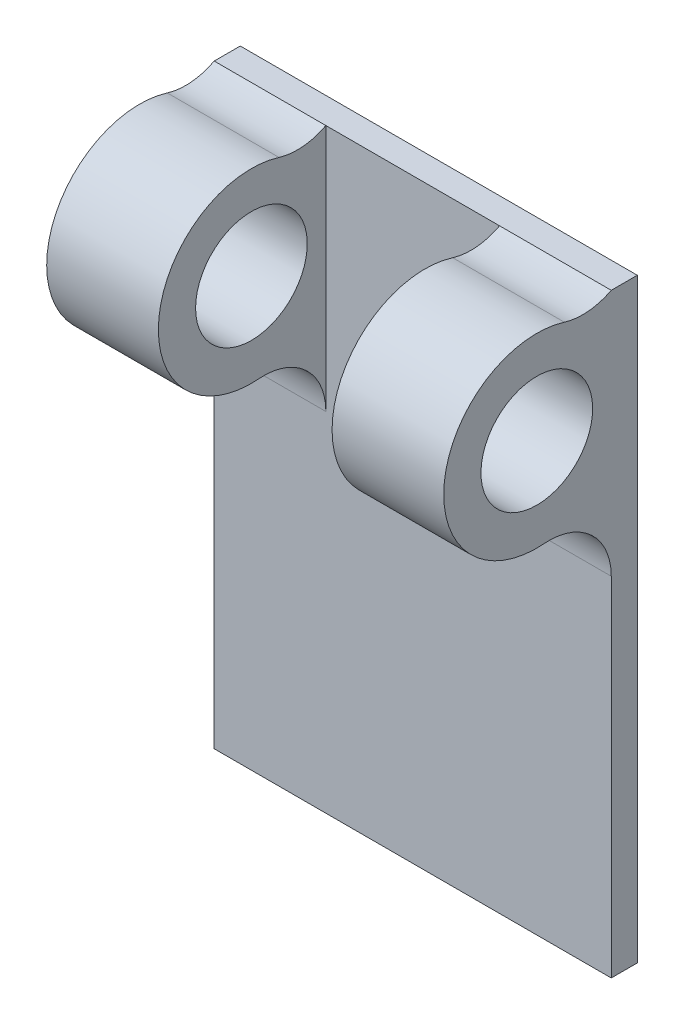
ISO-10303-21;
HEADER;
FILE_DESCRIPTION(('STEP AP214'),'2;1');
FILE_NAME('part.step','',(''),(''),'','','');
FILE_SCHEMA(('AUTOMOTIVE_DESIGN { 1 0 10303 214 1 1 1 1 }'));
ENDSEC;
DATA;
#1=APPLICATION_CONTEXT('core data for automotive mechanical design processes');
#2=APPLICATION_PROTOCOL_DEFINITION('international standard','automotive_design',2000,#1);
#3=PRODUCT_CONTEXT('',#1,'mechanical');
#4=PRODUCT('Part','Part','',(#3));
#5=PRODUCT_RELATED_PRODUCT_CATEGORY('part','',(#4));
#6=PRODUCT_DEFINITION_FORMATION('','',#4);
#7=PRODUCT_DEFINITION_CONTEXT('part definition',#1,'design');
#8=PRODUCT_DEFINITION('design','',#6,#7);
#9=PRODUCT_DEFINITION_SHAPE('','',#8);
#10=(LENGTH_UNIT() NAMED_UNIT(*) SI_UNIT(.MILLI.,.METRE.));
#11=(NAMED_UNIT(*) PLANE_ANGLE_UNIT() SI_UNIT($,.RADIAN.));
#12=(NAMED_UNIT(*) SI_UNIT($,.STERADIAN.) SOLID_ANGLE_UNIT());
#13=UNCERTAINTY_MEASURE_WITH_UNIT(LENGTH_MEASURE(1.E-05),#10,'distance_accuracy_value','');
#14=(GEOMETRIC_REPRESENTATION_CONTEXT(3) GLOBAL_UNCERTAINTY_ASSIGNED_CONTEXT((#13)) GLOBAL_UNIT_ASSIGNED_CONTEXT((#10,
#11,#12)) REPRESENTATION_CONTEXT('',''));
#15=CARTESIAN_POINT('',(0.,0.,0.));
#16=DIRECTION('',(0.,0.,1.));
#17=DIRECTION('',(1.,0.,0.));
#18=AXIS2_PLACEMENT_3D('',#15,#16,#17);
#19=CARTESIAN_POINT('',(640.,-150.,162.));
#20=DIRECTION('',(-1.,0.,0.));
#21=DIRECTION('',(0.,-1.,0.));
#22=AXIS2_PLACEMENT_3D('',#19,#20,#21);
#23=CYLINDRICAL_SURFACE('',#22,90.);
#24=CARTESIAN_POINT('',(180.,-150.,162.));
#25=DIRECTION('',(-1.,0.,0.));
#26=DIRECTION('',(0.,0.,1.));
#27=AXIS2_PLACEMENT_3D('',#24,#25,#26);
#28=CIRCLE('',#27,90.);
#29=CARTESIAN_POINT('',(180.,-150.,252.));
#30=VERTEX_POINT('',#29);
#31=EDGE_CURVE('E152',#30,#30,#28,.F.);
#32=ORIENTED_EDGE('',*,*,#31,.T.);
#33=EDGE_LOOP('',(#32));
#34=FACE_BOUND('',#33,.T.);
#35=CARTESIAN_POINT('',(0.,-150.,162.));
#36=DIRECTION('',(-1.,0.,0.));
#37=DIRECTION('',(0.,-1.,0.));
#38=AXIS2_PLACEMENT_3D('',#35,#36,#37);
#39=CIRCLE('',#38,90.);
#40=CARTESIAN_POINT('',(0.,-240.,162.));
#41=VERTEX_POINT('',#40);
#42=EDGE_CURVE('E231',#41,#41,#39,.T.);
#43=ORIENTED_EDGE('',*,*,#42,.T.);
#44=EDGE_LOOP('',(#43));
#45=FACE_BOUND('',#44,.T.);
#46=ADVANCED_FACE('F43',(#34,#45),#23,.F.);
#47=CARTESIAN_POINT('',(640.,-150.,162.));
#48=DIRECTION('',(-1.,0.,0.));
#49=DIRECTION('',(0.,-1.,0.));
#50=AXIS2_PLACEMENT_3D('',#47,#48,#49);
#51=CYLINDRICAL_SURFACE('',#50,150.);
#52=CARTESIAN_POINT('',(180.,-150.,162.));
#53=DIRECTION('',(-1.,0.,0.));
#54=DIRECTION('',(0.,0.,1.));
#55=AXIS2_PLACEMENT_3D('',#52,#53,#54);
#56=CIRCLE('',#55,150.);
#57=CARTESIAN_POINT('',(180.,-6.72295296391534,117.596308795106));
#58=VERTEX_POINT('',#57);
#59=CARTESIAN_POINT('',(180.,-299.519229532525,150.));
#60=VERTEX_POINT('',#59);
#61=EDGE_CURVE('E153',#58,#60,#56,.F.);
#62=ORIENTED_EDGE('',*,*,#61,.F.);
#63=DIRECTION('',(-1.,0.,0.));
#64=VECTOR('',#63,1.);
#65=CARTESIAN_POINT('',(640.,-6.72295296391528,117.596308795106));
#66=LINE('',#65,#64);
#67=CARTESIAN_POINT('',(0.,-6.72295296391537,117.596308795106));
#68=VERTEX_POINT('',#67);
#69=EDGE_CURVE('E151',#58,#68,#66,.T.);
#70=ORIENTED_EDGE('',*,*,#69,.T.);
#71=CARTESIAN_POINT('',(0.,-150.,162.));
#72=DIRECTION('',(-1.,0.,0.));
#73=DIRECTION('',(0.,-1.,0.));
#74=AXIS2_PLACEMENT_3D('',#71,#72,#73);
#75=CIRCLE('',#74,150.);
#76=CARTESIAN_POINT('',(0.,-299.519229532525,150.));
#77=VERTEX_POINT('',#76);
#78=EDGE_CURVE('E226',#77,#68,#75,.T.);
#79=ORIENTED_EDGE('',*,*,#78,.F.);
#80=DIRECTION('',(-1.,0.,0.));
#81=VECTOR('',#80,1.);
#82=CARTESIAN_POINT('',(640.,-299.519229532525,150.));
#83=LINE('',#82,#81);
#84=EDGE_CURVE('E188',#77,#60,#83,.F.);
#85=ORIENTED_EDGE('',*,*,#84,.T.);
#86=EDGE_LOOP('',(#62,#70,#79,#85));
#87=FACE_BOUND('',#86,.T.);
#88=ADVANCED_FACE('F250',(#87),#51,.T.);
#89=CARTESIAN_POINT('',(0.,88.7950783934744,87.9938479918426));
#90=DIRECTION('',(1.,0.,0.));
#91=DIRECTION('',(0.,1.,0.));
#92=AXIS2_PLACEMENT_3D('',#89,#90,#91);
#93=CYLINDRICAL_SURFACE('',#92,100.);
#94=ORIENTED_EDGE('',*,*,#69,.F.);
#95=CARTESIAN_POINT('',(180.,88.7950783934745,87.9938479918426));
#96=DIRECTION('',(-1.,0.,0.));
#97=DIRECTION('',(0.,0.,1.));
#98=AXIS2_PLACEMENT_3D('',#95,#96,#97);
#99=CIRCLE('',#98,100.);
#100=CARTESIAN_POINT('',(180.,0.,42.));
#101=VERTEX_POINT('',#100);
#102=EDGE_CURVE('E141',#58,#101,#99,.F.);
#103=ORIENTED_EDGE('',*,*,#102,.T.);
#104=DIRECTION('',(-1.,0.,0.));
#105=VECTOR('',#104,1.);
#106=CARTESIAN_POINT('',(0.,0.,42.));
#107=LINE('',#106,#105);
#108=CARTESIAN_POINT('',(0.,0.,42.));
#109=VERTEX_POINT('',#108);
#110=EDGE_CURVE('E149',#101,#109,#107,.T.);
#111=ORIENTED_EDGE('',*,*,#110,.T.);
#112=CARTESIAN_POINT('',(0.,88.7950783934744,87.9938479918426));
#113=DIRECTION('',(1.,0.,0.));
#114=DIRECTION('',(0.,1.,0.));
#115=AXIS2_PLACEMENT_3D('',#112,#113,#114);
#116=CIRCLE('',#115,100.);
#117=EDGE_CURVE('E197',#68,#109,#116,.T.);
#118=ORIENTED_EDGE('',*,*,#117,.F.);
#119=EDGE_LOOP('',(#94,#103,#111,#118));
#120=FACE_BOUND('',#119,.T.);
#121=ADVANCED_FACE('F147',(#120),#93,.F.);
#122=CARTESIAN_POINT('',(640.,-399.198715887542,142.));
#123=DIRECTION('',(-1.,0.,0.));
#124=DIRECTION('',(0.,-1.,0.));
#125=AXIS2_PLACEMENT_3D('',#122,#123,#124);
#126=CYLINDRICAL_SURFACE('',#125,100.);
#127=DIRECTION('',(1.,0.,0.));
#128=VECTOR('',#127,1.);
#129=CARTESIAN_POINT('',(0.,-399.198715887542,42.));
#130=LINE('',#129,#128);
#131=CARTESIAN_POINT('',(180.,-399.198715887542,42.));
#132=VERTEX_POINT('',#131);
#133=CARTESIAN_POINT('',(0.,-399.198715887542,42.));
#134=VERTEX_POINT('',#133);
#135=EDGE_CURVE('E194',#132,#134,#130,.F.);
#136=ORIENTED_EDGE('',*,*,#135,.F.);
#137=CARTESIAN_POINT('',(180.,-399.198715887542,142.));
#138=DIRECTION('',(-1.,0.,0.));
#139=DIRECTION('',(0.,0.,1.));
#140=AXIS2_PLACEMENT_3D('',#137,#138,#139);
#141=CIRCLE('',#140,100.);
#142=EDGE_CURVE('E11',#132,#60,#141,.F.);
#143=ORIENTED_EDGE('',*,*,#142,.T.);
#144=ORIENTED_EDGE('',*,*,#84,.F.);
#145=CARTESIAN_POINT('',(0.,-399.198715887542,142.));
#146=DIRECTION('',(1.,0.,0.));
#147=DIRECTION('',(0.,1.,0.));
#148=AXIS2_PLACEMENT_3D('',#145,#146,#147);
#149=CIRCLE('',#148,100.);
#150=EDGE_CURVE('E202',#134,#77,#149,.T.);
#151=ORIENTED_EDGE('',*,*,#150,.F.);
#152=EDGE_LOOP('',(#136,#143,#144,#151));
#153=FACE_BOUND('',#152,.T.);
#154=ADVANCED_FACE('F247',(#153),#126,.F.);
#155=CARTESIAN_POINT('',(0.,0.,42.));
#156=DIRECTION('',(1.,0.,0.));
#157=DIRECTION('',(0.,1.,0.));
#158=AXIS2_PLACEMENT_3D('',#155,#156,#157);
#159=PLANE('',#158);
#160=DIRECTION('',(0.,-1.,0.));
#161=VECTOR('',#160,1.);
#162=CARTESIAN_POINT('',(0.,0.,42.));
#163=LINE('',#162,#161);
#164=CARTESIAN_POINT('',(1.17566092718146E-13,-960.,42.));
#165=VERTEX_POINT('',#164);
#166=EDGE_CURVE('E176',#134,#165,#163,.T.);
#167=ORIENTED_EDGE('',*,*,#166,.F.);
#168=ORIENTED_EDGE('',*,*,#150,.T.);
#169=ORIENTED_EDGE('',*,*,#78,.T.);
#170=ORIENTED_EDGE('',*,*,#117,.T.);
#171=DIRECTION('',(0.,0.,-1.));
#172=VECTOR('',#171,1.);
#173=CARTESIAN_POINT('',(0.,0.,42.));
#174=LINE('',#173,#172);
#175=CARTESIAN_POINT('',(0.,0.,0.));
#176=VERTEX_POINT('',#175);
#177=EDGE_CURVE('E158',#109,#176,#174,.T.);
#178=ORIENTED_EDGE('',*,*,#177,.T.);
#179=DIRECTION('',(0.,-1.,0.));
#180=VECTOR('',#179,1.);
#181=CARTESIAN_POINT('',(0.,0.,0.));
#182=LINE('',#181,#180);
#183=CARTESIAN_POINT('',(1.17566092718146E-13,-960.,0.));
#184=VERTEX_POINT('',#183);
#185=EDGE_CURVE('E166',#176,#184,#182,.T.);
#186=ORIENTED_EDGE('',*,*,#185,.T.);
#187=DIRECTION('',(0.,0.,-1.));
#188=VECTOR('',#187,1.);
#189=CARTESIAN_POINT('',(1.17566092718146E-13,-960.,42.));
#190=LINE('',#189,#188);
#191=EDGE_CURVE('E184',#165,#184,#190,.T.);
#192=ORIENTED_EDGE('',*,*,#191,.F.);
#193=EDGE_LOOP('',(#167,#168,#169,#170,#178,#186,#192));
#194=FACE_BOUND('',#193,.T.);
#195=ORIENTED_EDGE('',*,*,#42,.F.);
#196=EDGE_LOOP('',(#195));
#197=FACE_BOUND('',#196,.T.);
#198=ADVANCED_FACE('F221',(#194,#197),#159,.F.);
#199=CARTESIAN_POINT('',(1.17566092718146E-13,-960.,42.));
#200=DIRECTION('',(0.,1.,0.));
#201=DIRECTION('',(0.,0.,1.));
#202=AXIS2_PLACEMENT_3D('',#199,#200,#201);
#203=PLANE('',#202);
#204=DIRECTION('',(1.,0.,0.));
#205=VECTOR('',#204,1.);
#206=CARTESIAN_POINT('',(1.17566092718146E-13,-960.,0.));
#207=LINE('',#206,#205);
#208=CARTESIAN_POINT('',(640.,-960.,0.));
#209=VERTEX_POINT('',#208);
#210=EDGE_CURVE('E169',#184,#209,#207,.T.);
#211=ORIENTED_EDGE('',*,*,#210,.T.);
#212=DIRECTION('',(0.,0.,-1.));
#213=VECTOR('',#212,1.);
#214=CARTESIAN_POINT('',(640.,-960.,42.));
#215=LINE('',#214,#213);
#216=CARTESIAN_POINT('',(640.,-960.,42.));
#217=VERTEX_POINT('',#216);
#218=EDGE_CURVE('E181',#217,#209,#215,.T.);
#219=ORIENTED_EDGE('',*,*,#218,.F.);
#220=DIRECTION('',(1.,0.,0.));
#221=VECTOR('',#220,1.);
#222=CARTESIAN_POINT('',(1.17566092718146E-13,-960.,42.));
#223=LINE('',#222,#221);
#224=EDGE_CURVE('E162',#165,#217,#223,.T.);
#225=ORIENTED_EDGE('',*,*,#224,.F.);
#226=ORIENTED_EDGE('',*,*,#191,.T.);
#227=EDGE_LOOP('',(#211,#219,#225,#226));
#228=FACE_BOUND('',#227,.T.);
#229=ADVANCED_FACE('F239',(#228),#203,.F.);
#230=CARTESIAN_POINT('',(640.,0.,42.));
#231=DIRECTION('',(-1.,0.,0.));
#232=DIRECTION('',(0.,0.,1.));
#233=AXIS2_PLACEMENT_3D('',#230,#231,#232);
#234=PLANE('',#233);
#235=DIRECTION('',(0.,0.,-1.));
#236=VECTOR('',#235,1.);
#237=CARTESIAN_POINT('',(640.,0.,42.));
#238=LINE('',#237,#236);
#239=CARTESIAN_POINT('',(640.,0.,42.));
#240=VERTEX_POINT('',#239);
#241=CARTESIAN_POINT('',(640.,0.,0.));
#242=VERTEX_POINT('',#241);
#243=EDGE_CURVE('E178',#240,#242,#238,.T.);
#244=ORIENTED_EDGE('',*,*,#243,.F.);
#245=CARTESIAN_POINT('',(640.,88.7950783934745,87.9938479918426));
#246=DIRECTION('',(-1.,0.,0.));
#247=DIRECTION('',(0.,0.,1.));
#248=AXIS2_PLACEMENT_3D('',#245,#246,#247);
#249=CIRCLE('',#248,100.);
#250=CARTESIAN_POINT('',(640.,-6.72295296391528,117.596308795106));
#251=VERTEX_POINT('',#250);
#252=EDGE_CURVE('E199',#240,#251,#249,.T.);
#253=ORIENTED_EDGE('',*,*,#252,.T.);
#254=CARTESIAN_POINT('',(640.,-150.,162.));
#255=DIRECTION('',(-1.,0.,0.));
#256=DIRECTION('',(0.,-1.,0.));
#257=AXIS2_PLACEMENT_3D('',#254,#255,#256);
#258=CIRCLE('',#257,150.);
#259=CARTESIAN_POINT('',(640.,-299.519229532525,150.));
#260=VERTEX_POINT('',#259);
#261=EDGE_CURVE('E170',#260,#251,#258,.T.);
#262=ORIENTED_EDGE('',*,*,#261,.F.);
#263=CARTESIAN_POINT('',(640.,-399.198715887542,142.));
#264=DIRECTION('',(-1.,0.,0.));
#265=DIRECTION('',(0.,0.,1.));
#266=AXIS2_PLACEMENT_3D('',#263,#264,#265);
#267=CIRCLE('',#266,100.);
#268=CARTESIAN_POINT('',(640.,-399.198715887542,42.));
#269=VERTEX_POINT('',#268);
#270=EDGE_CURVE('E66',#260,#269,#267,.T.);
#271=ORIENTED_EDGE('',*,*,#270,.T.);
#272=DIRECTION('',(0.,1.,0.));
#273=VECTOR('',#272,1.);
#274=CARTESIAN_POINT('',(640.,0.,42.));
#275=LINE('',#274,#273);
#276=EDGE_CURVE('E160',#217,#269,#275,.T.);
#277=ORIENTED_EDGE('',*,*,#276,.F.);
#278=ORIENTED_EDGE('',*,*,#218,.T.);
#279=DIRECTION('',(0.,1.,0.));
#280=VECTOR('',#279,1.);
#281=CARTESIAN_POINT('',(640.,0.,0.));
#282=LINE('',#281,#280);
#283=EDGE_CURVE('E172',#209,#242,#282,.T.);
#284=ORIENTED_EDGE('',*,*,#283,.T.);
#285=EDGE_LOOP('',(#244,#253,#262,#271,#277,#278,#284));
#286=FACE_BOUND('',#285,.T.);
#287=CARTESIAN_POINT('',(640.,-150.,162.));
#288=DIRECTION('',(-1.,0.,0.));
#289=DIRECTION('',(0.,-1.,0.));
#290=AXIS2_PLACEMENT_3D('',#287,#288,#289);
#291=CIRCLE('',#290,90.);
#292=CARTESIAN_POINT('',(640.,-240.,162.));
#293=VERTEX_POINT('',#292);
#294=EDGE_CURVE('E230',#293,#293,#291,.T.);
#295=ORIENTED_EDGE('',*,*,#294,.T.);
#296=EDGE_LOOP('',(#295));
#297=FACE_BOUND('',#296,.T.);
#298=ADVANCED_FACE('F211',(#286,#297),#234,.F.);
#299=CARTESIAN_POINT('',(0.,0.,42.));
#300=DIRECTION('',(0.,-1.,0.));
#301=DIRECTION('',(0.,0.,-1.));
#302=AXIS2_PLACEMENT_3D('',#299,#300,#301);
#303=PLANE('',#302);
#304=DIRECTION('',(-1.,0.,0.));
#305=VECTOR('',#304,1.);
#306=CARTESIAN_POINT('',(0.,0.,0.));
#307=LINE('',#306,#305);
#308=EDGE_CURVE('E174',#242,#176,#307,.T.);
#309=ORIENTED_EDGE('',*,*,#308,.T.);
#310=ORIENTED_EDGE('',*,*,#177,.F.);
#311=ORIENTED_EDGE('',*,*,#110,.F.);
#312=DIRECTION('',(1.,0.,0.));
#313=VECTOR('',#312,1.);
#314=CARTESIAN_POINT('',(0.,0.,42.));
#315=LINE('',#314,#313);
#316=CARTESIAN_POINT('',(460.,0.,42.));
#317=VERTEX_POINT('',#316);
#318=EDGE_CURVE('E127',#101,#317,#315,.T.);
#319=ORIENTED_EDGE('',*,*,#318,.T.);
#320=EDGE_CURVE('E159',#240,#317,#107,.T.);
#321=ORIENTED_EDGE('',*,*,#320,.F.);
#322=ORIENTED_EDGE('',*,*,#243,.T.);
#323=EDGE_LOOP('',(#309,#310,#311,#319,#321,#322));
#324=FACE_BOUND('',#323,.T.);
#325=ADVANCED_FACE('F156',(#324),#303,.F.);
#326=CARTESIAN_POINT('',(0.,0.,42.));
#327=DIRECTION('',(0.,0.,1.));
#328=DIRECTION('',(1.,0.,0.));
#329=AXIS2_PLACEMENT_3D('',#326,#327,#328);
#330=PLANE('',#329);
#331=CARTESIAN_POINT('',(460.,-399.198715887542,42.));
#332=VERTEX_POINT('',#331);
#333=EDGE_CURVE('E195',#269,#332,#130,.F.);
#334=ORIENTED_EDGE('',*,*,#333,.T.);
#335=DIRECTION('',(0.,-1.,0.));
#336=VECTOR('',#335,1.);
#337=CARTESIAN_POINT('',(460.,93.0000000000002,42.));
#338=LINE('',#337,#336);
#339=EDGE_CURVE('E130',#317,#332,#338,.T.);
#340=ORIENTED_EDGE('',*,*,#339,.F.);
#341=ORIENTED_EDGE('',*,*,#318,.F.);
#342=DIRECTION('',(0.,-1.,0.));
#343=VECTOR('',#342,1.);
#344=CARTESIAN_POINT('',(180.,93.0000000000002,42.));
#345=LINE('',#344,#343);
#346=EDGE_CURVE('E58',#101,#132,#345,.T.);
#347=ORIENTED_EDGE('',*,*,#346,.T.);
#348=ORIENTED_EDGE('',*,*,#135,.T.);
#349=ORIENTED_EDGE('',*,*,#166,.T.);
#350=ORIENTED_EDGE('',*,*,#224,.T.);
#351=ORIENTED_EDGE('',*,*,#276,.T.);
#352=EDGE_LOOP('',(#334,#340,#341,#347,#348,#349,#350,#351));
#353=FACE_BOUND('',#352,.T.);
#354=ADVANCED_FACE('F129',(#353),#330,.T.);
#355=CARTESIAN_POINT('',(0.,0.,0.));
#356=DIRECTION('',(0.,0.,1.));
#357=DIRECTION('',(1.,0.,0.));
#358=AXIS2_PLACEMENT_3D('',#355,#356,#357);
#359=PLANE('',#358);
#360=ORIENTED_EDGE('',*,*,#185,.F.);
#361=ORIENTED_EDGE('',*,*,#308,.F.);
#362=ORIENTED_EDGE('',*,*,#283,.F.);
#363=ORIENTED_EDGE('',*,*,#210,.F.);
#364=EDGE_LOOP('',(#360,#361,#362,#363));
#365=FACE_BOUND('',#364,.T.);
#366=ADVANCED_FACE('F218',(#365),#359,.F.);
#367=CARTESIAN_POINT('',(460.,-150.,162.));
#368=DIRECTION('',(1.,0.,0.));
#369=DIRECTION('',(0.,0.,-1.));
#370=AXIS2_PLACEMENT_3D('',#367,#368,#369);
#371=CIRCLE('',#370,90.);
#372=CARTESIAN_POINT('',(460.,-150.,72.));
#373=VERTEX_POINT('',#372);
#374=EDGE_CURVE('E274',#373,#373,#371,.F.);
#375=ORIENTED_EDGE('',*,*,#374,.T.);
#376=EDGE_LOOP('',(#375));
#377=FACE_BOUND('',#376,.T.);
#378=ORIENTED_EDGE('',*,*,#294,.F.);
#379=EDGE_LOOP('',(#378));
#380=FACE_BOUND('',#379,.T.);
#381=ADVANCED_FACE('F253',(#377,#380),#23,.F.);
#382=CARTESIAN_POINT('',(460.,-150.,162.));
#383=DIRECTION('',(1.,0.,0.));
#384=DIRECTION('',(0.,0.,-1.));
#385=AXIS2_PLACEMENT_3D('',#382,#383,#384);
#386=CIRCLE('',#385,150.);
#387=CARTESIAN_POINT('',(460.,-299.519229532525,150.));
#388=VERTEX_POINT('',#387);
#389=CARTESIAN_POINT('',(460.,-6.72295296391531,117.596308795106));
#390=VERTEX_POINT('',#389);
#391=EDGE_CURVE('E135',#388,#390,#386,.F.);
#392=ORIENTED_EDGE('',*,*,#391,.F.);
#393=EDGE_CURVE('E187',#388,#260,#83,.F.);
#394=ORIENTED_EDGE('',*,*,#393,.T.);
#395=ORIENTED_EDGE('',*,*,#261,.T.);
#396=EDGE_CURVE('E191',#251,#390,#66,.T.);
#397=ORIENTED_EDGE('',*,*,#396,.T.);
#398=EDGE_LOOP('',(#392,#394,#395,#397));
#399=FACE_BOUND('',#398,.T.);
#400=ADVANCED_FACE('F258',(#399),#51,.T.);
#401=ORIENTED_EDGE('',*,*,#320,.T.);
#402=CARTESIAN_POINT('',(460.,88.7950783934745,87.9938479918426));
#403=DIRECTION('',(1.,0.,0.));
#404=DIRECTION('',(0.,0.,-1.));
#405=AXIS2_PLACEMENT_3D('',#402,#403,#404);
#406=CIRCLE('',#405,100.);
#407=EDGE_CURVE('E277',#317,#390,#406,.F.);
#408=ORIENTED_EDGE('',*,*,#407,.T.);
#409=ORIENTED_EDGE('',*,*,#396,.F.);
#410=ORIENTED_EDGE('',*,*,#252,.F.);
#411=EDGE_LOOP('',(#401,#408,#409,#410));
#412=FACE_BOUND('',#411,.T.);
#413=ADVANCED_FACE('F268',(#412),#93,.F.);
#414=ORIENTED_EDGE('',*,*,#393,.F.);
#415=CARTESIAN_POINT('',(460.,-399.198715887542,142.));
#416=DIRECTION('',(1.,0.,0.));
#417=DIRECTION('',(0.,0.,-1.));
#418=AXIS2_PLACEMENT_3D('',#415,#416,#417);
#419=CIRCLE('',#418,100.);
#420=EDGE_CURVE('E51',#388,#332,#419,.F.);
#421=ORIENTED_EDGE('',*,*,#420,.T.);
#422=ORIENTED_EDGE('',*,*,#333,.F.);
#423=ORIENTED_EDGE('',*,*,#270,.F.);
#424=EDGE_LOOP('',(#414,#421,#422,#423));
#425=FACE_BOUND('',#424,.T.);
#426=ADVANCED_FACE('F45',(#425),#126,.F.);
#427=CARTESIAN_POINT('',(180.,93.0000000000002,42.));
#428=DIRECTION('',(-1.,0.,0.));
#429=DIRECTION('',(0.,0.,1.));
#430=AXIS2_PLACEMENT_3D('',#427,#428,#429);
#431=PLANE('',#430);
#432=ORIENTED_EDGE('',*,*,#61,.T.);
#433=ORIENTED_EDGE('',*,*,#142,.F.);
#434=ORIENTED_EDGE('',*,*,#346,.F.);
#435=ORIENTED_EDGE('',*,*,#102,.F.);
#436=EDGE_LOOP('',(#432,#433,#434,#435));
#437=FACE_BOUND('',#436,.T.);
#438=ORIENTED_EDGE('',*,*,#31,.F.);
#439=EDGE_LOOP('',(#438));
#440=FACE_BOUND('',#439,.T.);
#441=ADVANCED_FACE('F139',(#437,#440),#431,.F.);
#442=CARTESIAN_POINT('',(460.,93.0000000000002,42.));
#443=DIRECTION('',(1.,0.,0.));
#444=DIRECTION('',(0.,0.,-1.));
#445=AXIS2_PLACEMENT_3D('',#442,#443,#444);
#446=PLANE('',#445);
#447=ORIENTED_EDGE('',*,*,#339,.T.);
#448=ORIENTED_EDGE('',*,*,#420,.F.);
#449=ORIENTED_EDGE('',*,*,#391,.T.);
#450=ORIENTED_EDGE('',*,*,#407,.F.);
#451=EDGE_LOOP('',(#447,#448,#449,#450));
#452=FACE_BOUND('',#451,.T.);
#453=ORIENTED_EDGE('',*,*,#374,.F.);
#454=EDGE_LOOP('',(#453));
#455=FACE_BOUND('',#454,.T.);
#456=ADVANCED_FACE('F288',(#452,#455),#446,.F.);
#457=CLOSED_SHELL('',(#46,#88,#121,#154,#198,#229,#298,#325,#354,#366,#381,#400,#413,#426,#441,#456));
#458=MANIFOLD_SOLID_BREP('B2',#457);
#459=ADVANCED_BREP_SHAPE_REPRESENTATION('',(#18,#458),#14);
#460=SHAPE_DEFINITION_REPRESENTATION(#9,#459);
ENDSEC;
END-ISO-10303-21;
